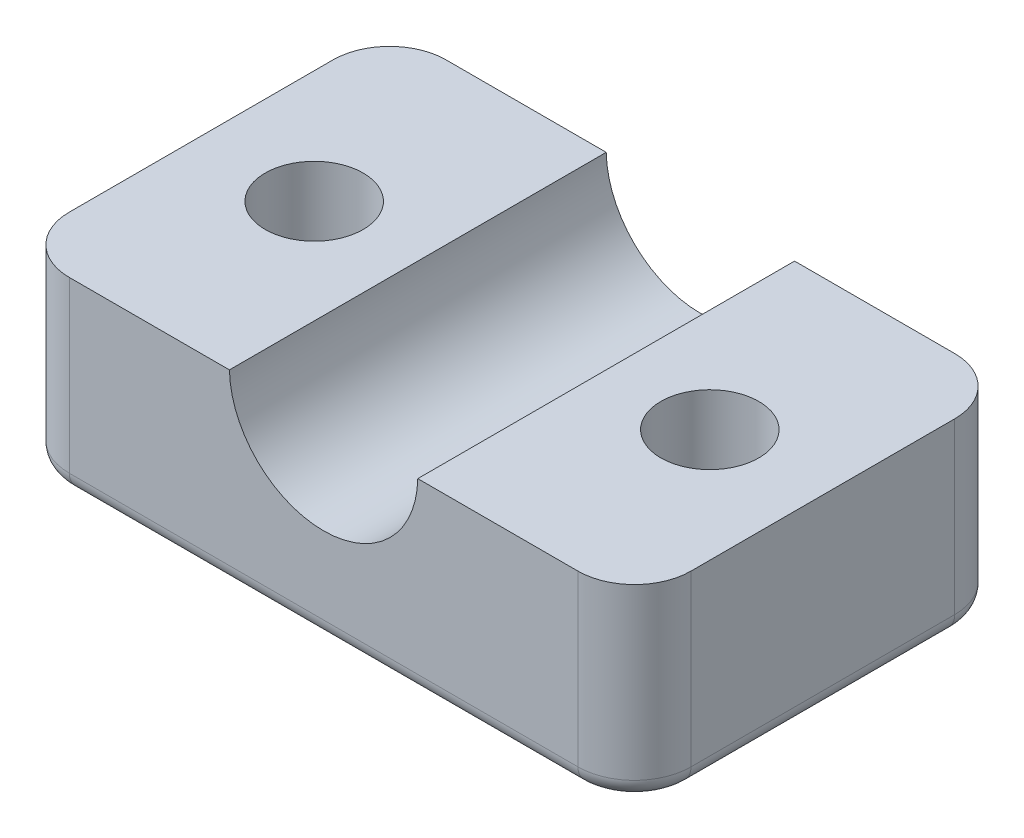
ISO-10303-21;
HEADER;
FILE_DESCRIPTION(('STEP AP214'),'2;1');
FILE_NAME('part.step','',(''),(''),'','','');
FILE_SCHEMA(('AUTOMOTIVE_DESIGN { 1 0 10303 214 1 1 1 1 }'));
ENDSEC;
DATA;
#1=APPLICATION_CONTEXT('core data for automotive mechanical design processes');
#2=APPLICATION_PROTOCOL_DEFINITION('international standard','automotive_design',2000,#1);
#3=PRODUCT_CONTEXT('',#1,'mechanical');
#4=PRODUCT('Part','Part','',(#3));
#5=PRODUCT_RELATED_PRODUCT_CATEGORY('part','',(#4));
#6=PRODUCT_DEFINITION_FORMATION('','',#4);
#7=PRODUCT_DEFINITION_CONTEXT('part definition',#1,'design');
#8=PRODUCT_DEFINITION('design','',#6,#7);
#9=PRODUCT_DEFINITION_SHAPE('','',#8);
#10=(LENGTH_UNIT() NAMED_UNIT(*) SI_UNIT(.MILLI.,.METRE.));
#11=(NAMED_UNIT(*) PLANE_ANGLE_UNIT() SI_UNIT($,.RADIAN.));
#12=(NAMED_UNIT(*) SI_UNIT($,.STERADIAN.) SOLID_ANGLE_UNIT());
#13=UNCERTAINTY_MEASURE_WITH_UNIT(LENGTH_MEASURE(1.E-05),#10,'distance_accuracy_value','');
#14=(GEOMETRIC_REPRESENTATION_CONTEXT(3) GLOBAL_UNCERTAINTY_ASSIGNED_CONTEXT((#13)) GLOBAL_UNIT_ASSIGNED_CONTEXT((#10,
#11,#12)) REPRESENTATION_CONTEXT('',''));
#15=CARTESIAN_POINT('',(0.,0.,0.));
#16=DIRECTION('',(0.,0.,1.));
#17=DIRECTION('',(1.,0.,0.));
#18=AXIS2_PLACEMENT_3D('',#15,#16,#17);
#19=CARTESIAN_POINT('',(-13.5,10.,7.));
#20=DIRECTION('',(0.,1.,0.));
#21=DIRECTION('',(0.,0.,1.));
#22=AXIS2_PLACEMENT_3D('',#19,#20,#21);
#23=PLANE('',#22);
#24=DIRECTION('',(0.,0.,-1.));
#25=VECTOR('',#24,1.);
#26=CARTESIAN_POINT('',(4.99899989998,10.,24.142135623731));
#27=LINE('',#26,#25);
#28=CARTESIAN_POINT('',(4.99899989998,10.,10.));
#29=VERTEX_POINT('',#28);
#30=CARTESIAN_POINT('',(4.99899989998,10.,-10.));
#31=VERTEX_POINT('',#30);
#32=EDGE_CURVE('E145',#29,#31,#27,.T.);
#33=ORIENTED_EDGE('',*,*,#32,.F.);
#34=DIRECTION('',(1.,0.,0.));
#35=VECTOR('',#34,1.);
#36=CARTESIAN_POINT('',(-13.5,10.,10.));
#37=LINE('',#36,#35);
#38=CARTESIAN_POINT('',(13.5,10.,10.));
#39=VERTEX_POINT('',#38);
#40=EDGE_CURVE('E151',#29,#39,#37,.T.);
#41=ORIENTED_EDGE('',*,*,#40,.T.);
#42=CARTESIAN_POINT('',(13.5,10.,7.));
#43=DIRECTION('',(0.,1.,0.));
#44=DIRECTION('',(0.,0.,1.));
#45=AXIS2_PLACEMENT_3D('',#42,#43,#44);
#46=CIRCLE('',#45,3.);
#47=CARTESIAN_POINT('',(16.5,10.,7.));
#48=VERTEX_POINT('',#47);
#49=EDGE_CURVE('E158',#39,#48,#46,.T.);
#50=ORIENTED_EDGE('',*,*,#49,.T.);
#51=DIRECTION('',(0.,0.,-1.));
#52=VECTOR('',#51,1.);
#53=CARTESIAN_POINT('',(16.5,10.,7.));
#54=LINE('',#53,#52);
#55=CARTESIAN_POINT('',(16.5,10.,-7.));
#56=VERTEX_POINT('',#55);
#57=EDGE_CURVE('E160',#48,#56,#54,.T.);
#58=ORIENTED_EDGE('',*,*,#57,.T.);
#59=CARTESIAN_POINT('',(13.5,10.,-7.));
#60=DIRECTION('',(0.,1.,0.));
#61=DIRECTION('',(0.,0.,1.));
#62=AXIS2_PLACEMENT_3D('',#59,#60,#61);
#63=CIRCLE('',#62,3.);
#64=CARTESIAN_POINT('',(13.5,10.,-10.));
#65=VERTEX_POINT('',#64);
#66=EDGE_CURVE('E166',#56,#65,#63,.T.);
#67=ORIENTED_EDGE('',*,*,#66,.T.);
#68=DIRECTION('',(-1.,0.,0.));
#69=VECTOR('',#68,1.);
#70=CARTESIAN_POINT('',(-13.5,10.,-10.));
#71=LINE('',#70,#69);
#72=EDGE_CURVE('E169',#65,#31,#71,.T.);
#73=ORIENTED_EDGE('',*,*,#72,.T.);
#74=EDGE_LOOP('',(#33,#41,#50,#58,#67,#73));
#75=FACE_BOUND('',#74,.T.);
#76=CARTESIAN_POINT('',(10.5,10.,0.));
#77=DIRECTION('',(0.,1.,0.));
#78=DIRECTION('',(0.,0.,1.));
#79=AXIS2_PLACEMENT_3D('',#76,#77,#78);
#80=CIRCLE('',#79,2.6);
#81=CARTESIAN_POINT('',(10.5,10.,2.6));
#82=VERTEX_POINT('',#81);
#83=EDGE_CURVE('E264',#82,#82,#80,.T.);
#84=ORIENTED_EDGE('',*,*,#83,.F.);
#85=EDGE_LOOP('',(#84));
#86=FACE_BOUND('',#85,.T.);
#87=ADVANCED_FACE('F33',(#75,#86),#23,.T.);
#88=DIRECTION('',(0.,0.,-1.));
#89=VECTOR('',#88,1.);
#90=CARTESIAN_POINT('',(-4.99899989998,10.,24.142135623731));
#91=LINE('',#90,#89);
#92=CARTESIAN_POINT('',(-4.99899989998,10.,-10.));
#93=VERTEX_POINT('',#92);
#94=CARTESIAN_POINT('',(-4.99899989998,10.,10.));
#95=VERTEX_POINT('',#94);
#96=EDGE_CURVE('E135',#93,#95,#91,.F.);
#97=ORIENTED_EDGE('',*,*,#96,.F.);
#98=CARTESIAN_POINT('',(-13.5,10.,-10.));
#99=VERTEX_POINT('',#98);
#100=EDGE_CURVE('E168',#93,#99,#71,.T.);
#101=ORIENTED_EDGE('',*,*,#100,.T.);
#102=CARTESIAN_POINT('',(-13.5,10.,-7.));
#103=DIRECTION('',(0.,1.,0.));
#104=DIRECTION('',(0.,0.,1.));
#105=AXIS2_PLACEMENT_3D('',#102,#103,#104);
#106=CIRCLE('',#105,3.);
#107=CARTESIAN_POINT('',(-16.5,10.,-7.));
#108=VERTEX_POINT('',#107);
#109=EDGE_CURVE('E172',#99,#108,#106,.T.);
#110=ORIENTED_EDGE('',*,*,#109,.T.);
#111=DIRECTION('',(0.,0.,1.));
#112=VECTOR('',#111,1.);
#113=CARTESIAN_POINT('',(-16.5,10.,7.));
#114=LINE('',#113,#112);
#115=CARTESIAN_POINT('',(-16.5,10.,7.));
#116=VERTEX_POINT('',#115);
#117=EDGE_CURVE('E174',#108,#116,#114,.T.);
#118=ORIENTED_EDGE('',*,*,#117,.T.);
#119=CARTESIAN_POINT('',(-13.5,10.,7.));
#120=DIRECTION('',(0.,1.,0.));
#121=DIRECTION('',(0.,0.,1.));
#122=AXIS2_PLACEMENT_3D('',#119,#120,#121);
#123=CIRCLE('',#122,3.);
#124=CARTESIAN_POINT('',(-13.5,10.,10.));
#125=VERTEX_POINT('',#124);
#126=EDGE_CURVE('E156',#116,#125,#123,.T.);
#127=ORIENTED_EDGE('',*,*,#126,.T.);
#128=EDGE_CURVE('E149',#125,#95,#37,.T.);
#129=ORIENTED_EDGE('',*,*,#128,.T.);
#130=EDGE_LOOP('',(#97,#101,#110,#118,#127,#129));
#131=FACE_BOUND('',#130,.T.);
#132=CARTESIAN_POINT('',(-10.5,10.,0.));
#133=DIRECTION('',(0.,1.,0.));
#134=DIRECTION('',(0.,0.,-1.));
#135=AXIS2_PLACEMENT_3D('',#132,#133,#134);
#136=CIRCLE('',#135,2.6);
#137=CARTESIAN_POINT('',(-10.5,10.,-2.6));
#138=VERTEX_POINT('',#137);
#139=EDGE_CURVE('E258',#138,#138,#136,.T.);
#140=ORIENTED_EDGE('',*,*,#139,.F.);
#141=EDGE_LOOP('',(#140));
#142=FACE_BOUND('',#141,.T.);
#143=ADVANCED_FACE('F153',(#131,#142),#23,.T.);
#144=CARTESIAN_POINT('',(-13.5,0.,7.));
#145=DIRECTION('',(0.,1.,0.));
#146=DIRECTION('',(0.,0.,1.));
#147=AXIS2_PLACEMENT_3D('',#144,#145,#146);
#148=PLANE('',#147);
#149=DIRECTION('',(1.,0.,0.));
#150=VECTOR('',#149,1.);
#151=CARTESIAN_POINT('',(-13.5,0.,9.));
#152=LINE('',#151,#150);
#153=CARTESIAN_POINT('',(13.5,0.,9.));
#154=VERTEX_POINT('',#153);
#155=CARTESIAN_POINT('',(-13.5,0.,9.));
#156=VERTEX_POINT('',#155);
#157=EDGE_CURVE('E200',#154,#156,#152,.F.);
#158=ORIENTED_EDGE('',*,*,#157,.T.);
#159=CARTESIAN_POINT('',(-13.5,0.,7.));
#160=DIRECTION('',(0.,1.,0.));
#161=DIRECTION('',(0.,0.,1.));
#162=AXIS2_PLACEMENT_3D('',#159,#160,#161);
#163=CIRCLE('',#162,2.);
#164=CARTESIAN_POINT('',(-15.5,0.,7.));
#165=VERTEX_POINT('',#164);
#166=EDGE_CURVE('E214',#156,#165,#163,.F.);
#167=ORIENTED_EDGE('',*,*,#166,.T.);
#168=DIRECTION('',(0.,0.,1.));
#169=VECTOR('',#168,1.);
#170=CARTESIAN_POINT('',(-15.5,0.,7.));
#171=LINE('',#170,#169);
#172=CARTESIAN_POINT('',(-15.5,0.,-7.));
#173=VERTEX_POINT('',#172);
#174=EDGE_CURVE('E212',#165,#173,#171,.F.);
#175=ORIENTED_EDGE('',*,*,#174,.T.);
#176=CARTESIAN_POINT('',(-13.5,0.,-7.));
#177=DIRECTION('',(0.,1.,0.));
#178=DIRECTION('',(0.,0.,1.));
#179=AXIS2_PLACEMENT_3D('',#176,#177,#178);
#180=CIRCLE('',#179,2.);
#181=CARTESIAN_POINT('',(-13.5,0.,-9.));
#182=VERTEX_POINT('',#181);
#183=EDGE_CURVE('E210',#173,#182,#180,.F.);
#184=ORIENTED_EDGE('',*,*,#183,.T.);
#185=DIRECTION('',(-1.,0.,0.));
#186=VECTOR('',#185,1.);
#187=CARTESIAN_POINT('',(-13.5,0.,-9.));
#188=LINE('',#187,#186);
#189=CARTESIAN_POINT('',(13.5,0.,-9.));
#190=VERTEX_POINT('',#189);
#191=EDGE_CURVE('E208',#182,#190,#188,.F.);
#192=ORIENTED_EDGE('',*,*,#191,.T.);
#193=CARTESIAN_POINT('',(13.5,0.,-7.));
#194=DIRECTION('',(0.,1.,0.));
#195=DIRECTION('',(0.,0.,1.));
#196=AXIS2_PLACEMENT_3D('',#193,#194,#195);
#197=CIRCLE('',#196,2.);
#198=CARTESIAN_POINT('',(15.5,0.,-7.));
#199=VERTEX_POINT('',#198);
#200=EDGE_CURVE('E206',#190,#199,#197,.F.);
#201=ORIENTED_EDGE('',*,*,#200,.T.);
#202=DIRECTION('',(0.,0.,-1.));
#203=VECTOR('',#202,1.);
#204=CARTESIAN_POINT('',(15.5,0.,7.));
#205=LINE('',#204,#203);
#206=CARTESIAN_POINT('',(15.5,0.,7.));
#207=VERTEX_POINT('',#206);
#208=EDGE_CURVE('E204',#199,#207,#205,.F.);
#209=ORIENTED_EDGE('',*,*,#208,.T.);
#210=CARTESIAN_POINT('',(13.5,0.,7.));
#211=DIRECTION('',(0.,1.,0.));
#212=DIRECTION('',(0.,0.,1.));
#213=AXIS2_PLACEMENT_3D('',#210,#211,#212);
#214=CIRCLE('',#213,2.);
#215=EDGE_CURVE('E202',#207,#154,#214,.F.);
#216=ORIENTED_EDGE('',*,*,#215,.T.);
#217=EDGE_LOOP('',(#158,#167,#175,#184,#192,#201,#209,#216));
#218=FACE_BOUND('',#217,.T.);
#219=CARTESIAN_POINT('',(10.5,0.,0.));
#220=DIRECTION('',(0.,1.,0.));
#221=DIRECTION('',(0.,0.,1.));
#222=AXIS2_PLACEMENT_3D('',#219,#220,#221);
#223=CIRCLE('',#222,2.6);
#224=CARTESIAN_POINT('',(10.5,0.,2.6));
#225=VERTEX_POINT('',#224);
#226=EDGE_CURVE('E261',#225,#225,#223,.T.);
#227=ORIENTED_EDGE('',*,*,#226,.T.);
#228=EDGE_LOOP('',(#227));
#229=FACE_BOUND('',#228,.T.);
#230=CARTESIAN_POINT('',(-10.5,0.,0.));
#231=DIRECTION('',(0.,1.,0.));
#232=DIRECTION('',(0.,0.,-1.));
#233=AXIS2_PLACEMENT_3D('',#230,#231,#232);
#234=CIRCLE('',#233,2.6);
#235=CARTESIAN_POINT('',(-10.5,0.,-2.6));
#236=VERTEX_POINT('',#235);
#237=EDGE_CURVE('E257',#236,#236,#234,.T.);
#238=ORIENTED_EDGE('',*,*,#237,.T.);
#239=EDGE_LOOP('',(#238));
#240=FACE_BOUND('',#239,.T.);
#241=ADVANCED_FACE('F269',(#218,#229,#240),#148,.F.);
#242=CARTESIAN_POINT('',(-13.5,10.,7.));
#243=DIRECTION('',(0.,-1.,0.));
#244=DIRECTION('',(0.,0.,-1.));
#245=AXIS2_PLACEMENT_3D('',#242,#243,#244);
#246=CYLINDRICAL_SURFACE('',#245,3.);
#247=DIRECTION('',(0.,-1.,0.));
#248=VECTOR('',#247,1.);
#249=CARTESIAN_POINT('',(-16.5,10.,7.));
#250=LINE('',#249,#248);
#251=CARTESIAN_POINT('',(-16.5,0.999999999999999,7.));
#252=VERTEX_POINT('',#251);
#253=EDGE_CURVE('E176',#116,#252,#250,.T.);
#254=ORIENTED_EDGE('',*,*,#253,.T.);
#255=CARTESIAN_POINT('',(-13.5,0.999999999999999,7.));
#256=DIRECTION('',(0.,1.,0.));
#257=DIRECTION('',(0.,0.,1.));
#258=AXIS2_PLACEMENT_3D('',#255,#256,#257);
#259=CIRCLE('',#258,3.);
#260=CARTESIAN_POINT('',(-13.5,0.999999999999999,10.));
#261=VERTEX_POINT('',#260);
#262=EDGE_CURVE('E197',#252,#261,#259,.T.);
#263=ORIENTED_EDGE('',*,*,#262,.T.);
#264=DIRECTION('',(0.,-1.,0.));
#265=VECTOR('',#264,1.);
#266=CARTESIAN_POINT('',(-13.5,10.,10.));
#267=LINE('',#266,#265);
#268=EDGE_CURVE('E195',#125,#261,#267,.T.);
#269=ORIENTED_EDGE('',*,*,#268,.F.);
#270=ORIENTED_EDGE('',*,*,#126,.F.);
#271=EDGE_LOOP('',(#254,#263,#269,#270));
#272=FACE_BOUND('',#271,.T.);
#273=ADVANCED_FACE('F296',(#272),#246,.T.);
#274=CARTESIAN_POINT('',(-13.5,10.,10.));
#275=DIRECTION('',(0.,0.,-1.));
#276=DIRECTION('',(-1.,0.,0.));
#277=AXIS2_PLACEMENT_3D('',#274,#275,#276);
#278=PLANE('',#277);
#279=ORIENTED_EDGE('',*,*,#268,.T.);
#280=DIRECTION('',(1.,0.,0.));
#281=VECTOR('',#280,1.);
#282=CARTESIAN_POINT('',(-13.5,0.999999999999999,10.));
#283=LINE('',#282,#281);
#284=CARTESIAN_POINT('',(13.5,0.999999999999999,10.));
#285=VERTEX_POINT('',#284);
#286=EDGE_CURVE('E11',#261,#285,#283,.T.);
#287=ORIENTED_EDGE('',*,*,#286,.T.);
#288=DIRECTION('',(0.,-1.,0.));
#289=VECTOR('',#288,1.);
#290=CARTESIAN_POINT('',(13.5,10.,10.));
#291=LINE('',#290,#289);
#292=EDGE_CURVE('E193',#39,#285,#291,.T.);
#293=ORIENTED_EDGE('',*,*,#292,.F.);
#294=ORIENTED_EDGE('',*,*,#40,.F.);
#295=CARTESIAN_POINT('',(0.,10.1,10.));
#296=DIRECTION('',(0.,0.,-1.));
#297=DIRECTION('',(-1.,0.,0.));
#298=AXIS2_PLACEMENT_3D('',#295,#296,#297);
#299=CIRCLE('',#298,5.);
#300=EDGE_CURVE('E138',#95,#29,#299,.F.);
#301=ORIENTED_EDGE('',*,*,#300,.F.);
#302=ORIENTED_EDGE('',*,*,#128,.F.);
#303=EDGE_LOOP('',(#279,#287,#293,#294,#301,#302));
#304=FACE_BOUND('',#303,.T.);
#305=ADVANCED_FACE('F148',(#304),#278,.F.);
#306=CARTESIAN_POINT('',(13.5,10.,7.));
#307=DIRECTION('',(0.,-1.,0.));
#308=DIRECTION('',(0.,0.,-1.));
#309=AXIS2_PLACEMENT_3D('',#306,#307,#308);
#310=CYLINDRICAL_SURFACE('',#309,3.);
#311=ORIENTED_EDGE('',*,*,#292,.T.);
#312=CARTESIAN_POINT('',(13.5,0.999999999999999,7.));
#313=DIRECTION('',(0.,1.,0.));
#314=DIRECTION('',(0.,0.,1.));
#315=AXIS2_PLACEMENT_3D('',#312,#313,#314);
#316=CIRCLE('',#315,3.);
#317=CARTESIAN_POINT('',(16.5,0.999999999999999,7.));
#318=VERTEX_POINT('',#317);
#319=EDGE_CURVE('E42',#285,#318,#316,.T.);
#320=ORIENTED_EDGE('',*,*,#319,.T.);
#321=DIRECTION('',(0.,-1.,0.));
#322=VECTOR('',#321,1.);
#323=CARTESIAN_POINT('',(16.5,10.,7.));
#324=LINE('',#323,#322);
#325=EDGE_CURVE('E191',#48,#318,#324,.T.);
#326=ORIENTED_EDGE('',*,*,#325,.F.);
#327=ORIENTED_EDGE('',*,*,#49,.F.);
#328=EDGE_LOOP('',(#311,#320,#326,#327));
#329=FACE_BOUND('',#328,.T.);
#330=ADVANCED_FACE('F313',(#329),#310,.T.);
#331=CARTESIAN_POINT('',(16.5,10.,7.));
#332=DIRECTION('',(-1.,0.,0.));
#333=DIRECTION('',(0.,0.,1.));
#334=AXIS2_PLACEMENT_3D('',#331,#332,#333);
#335=PLANE('',#334);
#336=ORIENTED_EDGE('',*,*,#325,.T.);
#337=DIRECTION('',(0.,0.,-1.));
#338=VECTOR('',#337,1.);
#339=CARTESIAN_POINT('',(16.5,0.999999999999999,7.));
#340=LINE('',#339,#338);
#341=CARTESIAN_POINT('',(16.5,0.999999999999999,-7.));
#342=VERTEX_POINT('',#341);
#343=EDGE_CURVE('E225',#318,#342,#340,.T.);
#344=ORIENTED_EDGE('',*,*,#343,.T.);
#345=DIRECTION('',(0.,-1.,0.));
#346=VECTOR('',#345,1.);
#347=CARTESIAN_POINT('',(16.5,10.,-7.));
#348=LINE('',#347,#346);
#349=EDGE_CURVE('E188',#56,#342,#348,.T.);
#350=ORIENTED_EDGE('',*,*,#349,.F.);
#351=ORIENTED_EDGE('',*,*,#57,.F.);
#352=EDGE_LOOP('',(#336,#344,#350,#351));
#353=FACE_BOUND('',#352,.T.);
#354=ADVANCED_FACE('F309',(#353),#335,.F.);
#355=CARTESIAN_POINT('',(13.5,10.,-7.));
#356=DIRECTION('',(0.,-1.,0.));
#357=DIRECTION('',(0.,0.,-1.));
#358=AXIS2_PLACEMENT_3D('',#355,#356,#357);
#359=CYLINDRICAL_SURFACE('',#358,3.);
#360=ORIENTED_EDGE('',*,*,#349,.T.);
#361=CARTESIAN_POINT('',(13.5,0.999999999999999,-7.));
#362=DIRECTION('',(0.,1.,0.));
#363=DIRECTION('',(0.,0.,1.));
#364=AXIS2_PLACEMENT_3D('',#361,#362,#363);
#365=CIRCLE('',#364,3.);
#366=CARTESIAN_POINT('',(13.5,0.999999999999999,-10.));
#367=VERTEX_POINT('',#366);
#368=EDGE_CURVE('E223',#342,#367,#365,.T.);
#369=ORIENTED_EDGE('',*,*,#368,.T.);
#370=DIRECTION('',(0.,-1.,0.));
#371=VECTOR('',#370,1.);
#372=CARTESIAN_POINT('',(13.5,10.,-10.));
#373=LINE('',#372,#371);
#374=EDGE_CURVE('E185',#65,#367,#373,.T.);
#375=ORIENTED_EDGE('',*,*,#374,.F.);
#376=ORIENTED_EDGE('',*,*,#66,.F.);
#377=EDGE_LOOP('',(#360,#369,#375,#376));
#378=FACE_BOUND('',#377,.T.);
#379=ADVANCED_FACE('F305',(#378),#359,.T.);
#380=CARTESIAN_POINT('',(-13.5,10.,-10.));
#381=DIRECTION('',(0.,0.,1.));
#382=DIRECTION('',(1.,0.,0.));
#383=AXIS2_PLACEMENT_3D('',#380,#381,#382);
#384=PLANE('',#383);
#385=ORIENTED_EDGE('',*,*,#374,.T.);
#386=DIRECTION('',(-1.,0.,0.));
#387=VECTOR('',#386,1.);
#388=CARTESIAN_POINT('',(-13.5,0.999999999999999,-10.));
#389=LINE('',#388,#387);
#390=CARTESIAN_POINT('',(-13.5,0.999999999999999,-10.));
#391=VERTEX_POINT('',#390);
#392=EDGE_CURVE('E221',#367,#391,#389,.T.);
#393=ORIENTED_EDGE('',*,*,#392,.T.);
#394=DIRECTION('',(0.,-1.,0.));
#395=VECTOR('',#394,1.);
#396=CARTESIAN_POINT('',(-13.5,10.,-10.));
#397=LINE('',#396,#395);
#398=EDGE_CURVE('E182',#99,#391,#397,.T.);
#399=ORIENTED_EDGE('',*,*,#398,.F.);
#400=ORIENTED_EDGE('',*,*,#100,.F.);
#401=CARTESIAN_POINT('',(0.,10.1,-10.));
#402=DIRECTION('',(0.,0.,-1.));
#403=DIRECTION('',(-1.,0.,0.));
#404=AXIS2_PLACEMENT_3D('',#401,#402,#403);
#405=CIRCLE('',#404,5.);
#406=EDGE_CURVE('E141',#31,#93,#405,.T.);
#407=ORIENTED_EDGE('',*,*,#406,.F.);
#408=ORIENTED_EDGE('',*,*,#72,.F.);
#409=EDGE_LOOP('',(#385,#393,#399,#400,#407,#408));
#410=FACE_BOUND('',#409,.T.);
#411=ADVANCED_FACE('F301',(#410),#384,.F.);
#412=CARTESIAN_POINT('',(-13.5,10.,-7.));
#413=DIRECTION('',(0.,-1.,0.));
#414=DIRECTION('',(0.,0.,-1.));
#415=AXIS2_PLACEMENT_3D('',#412,#413,#414);
#416=CYLINDRICAL_SURFACE('',#415,3.);
#417=ORIENTED_EDGE('',*,*,#398,.T.);
#418=CARTESIAN_POINT('',(-13.5,0.999999999999999,-7.));
#419=DIRECTION('',(0.,1.,0.));
#420=DIRECTION('',(0.,0.,1.));
#421=AXIS2_PLACEMENT_3D('',#418,#419,#420);
#422=CIRCLE('',#421,3.);
#423=CARTESIAN_POINT('',(-16.5,0.999999999999999,-7.));
#424=VERTEX_POINT('',#423);
#425=EDGE_CURVE('E219',#391,#424,#422,.T.);
#426=ORIENTED_EDGE('',*,*,#425,.T.);
#427=DIRECTION('',(0.,-1.,0.));
#428=VECTOR('',#427,1.);
#429=CARTESIAN_POINT('',(-16.5,10.,-7.));
#430=LINE('',#429,#428);
#431=EDGE_CURVE('E179',#108,#424,#430,.T.);
#432=ORIENTED_EDGE('',*,*,#431,.F.);
#433=ORIENTED_EDGE('',*,*,#109,.F.);
#434=EDGE_LOOP('',(#417,#426,#432,#433));
#435=FACE_BOUND('',#434,.T.);
#436=ADVANCED_FACE('F284',(#435),#416,.T.);
#437=CARTESIAN_POINT('',(-16.5,10.,7.));
#438=DIRECTION('',(1.,0.,0.));
#439=DIRECTION('',(0.,0.,-1.));
#440=AXIS2_PLACEMENT_3D('',#437,#438,#439);
#441=PLANE('',#440);
#442=ORIENTED_EDGE('',*,*,#431,.T.);
#443=DIRECTION('',(0.,0.,1.));
#444=VECTOR('',#443,1.);
#445=CARTESIAN_POINT('',(-16.5,0.999999999999999,7.));
#446=LINE('',#445,#444);
#447=EDGE_CURVE('E217',#424,#252,#446,.T.);
#448=ORIENTED_EDGE('',*,*,#447,.T.);
#449=ORIENTED_EDGE('',*,*,#253,.F.);
#450=ORIENTED_EDGE('',*,*,#117,.F.);
#451=EDGE_LOOP('',(#442,#448,#449,#450));
#452=FACE_BOUND('',#451,.T.);
#453=ADVANCED_FACE('F275',(#452),#441,.F.);
#454=CARTESIAN_POINT('',(10.5,10.,0.));
#455=DIRECTION('',(0.,-1.,0.));
#456=DIRECTION('',(0.,0.,-1.));
#457=AXIS2_PLACEMENT_3D('',#454,#455,#456);
#458=CYLINDRICAL_SURFACE('',#457,2.6);
#459=ORIENTED_EDGE('',*,*,#83,.T.);
#460=EDGE_LOOP('',(#459));
#461=FACE_BOUND('',#460,.T.);
#462=ORIENTED_EDGE('',*,*,#226,.F.);
#463=EDGE_LOOP('',(#462));
#464=FACE_BOUND('',#463,.T.);
#465=ADVANCED_FACE('F272',(#461,#464),#458,.F.);
#466=CARTESIAN_POINT('',(-10.5,10.,0.));
#467=DIRECTION('',(0.,-1.,0.));
#468=DIRECTION('',(0.,0.,-1.));
#469=AXIS2_PLACEMENT_3D('',#466,#467,#468);
#470=CYLINDRICAL_SURFACE('',#469,2.6);
#471=ORIENTED_EDGE('',*,*,#139,.T.);
#472=EDGE_LOOP('',(#471));
#473=FACE_BOUND('',#472,.T.);
#474=ORIENTED_EDGE('',*,*,#237,.F.);
#475=EDGE_LOOP('',(#474));
#476=FACE_BOUND('',#475,.T.);
#477=ADVANCED_FACE('F274',(#473,#476),#470,.F.);
#478=CARTESIAN_POINT('',(0.,10.1,24.142135623731));
#479=DIRECTION('',(0.,0.,-1.));
#480=DIRECTION('',(-1.,0.,0.));
#481=AXIS2_PLACEMENT_3D('',#478,#479,#480);
#482=CYLINDRICAL_SURFACE('',#481,5.);
#483=ORIENTED_EDGE('',*,*,#32,.T.);
#484=ORIENTED_EDGE('',*,*,#406,.T.);
#485=ORIENTED_EDGE('',*,*,#96,.T.);
#486=ORIENTED_EDGE('',*,*,#300,.T.);
#487=EDGE_LOOP('',(#483,#484,#485,#486));
#488=FACE_BOUND('',#487,.T.);
#489=ADVANCED_FACE('F137',(#488),#482,.F.);
#490=CARTESIAN_POINT('',(13.5,0.999999999999999,-7.));
#491=DIRECTION('',(0.,1.,0.));
#492=DIRECTION('',(0.,0.,1.));
#493=AXIS2_PLACEMENT_3D('',#490,#491,#492);
#494=TOROIDAL_SURFACE('',#493,2.,1.);
#495=CARTESIAN_POINT('',(15.5,1.,-7.));
#496=DIRECTION('',(0.,0.,1.));
#497=DIRECTION('',(1.,0.,0.));
#498=AXIS2_PLACEMENT_3D('',#495,#496,#497);
#499=CIRCLE('',#498,1.);
#500=EDGE_CURVE('E243',#199,#342,#499,.T.);
#501=ORIENTED_EDGE('',*,*,#500,.F.);
#502=ORIENTED_EDGE('',*,*,#200,.F.);
#503=CARTESIAN_POINT('',(13.5,0.999999999999999,-9.));
#504=DIRECTION('',(-1.,0.,0.));
#505=DIRECTION('',(0.,0.,1.));
#506=AXIS2_PLACEMENT_3D('',#503,#504,#505);
#507=CIRCLE('',#506,1.);
#508=EDGE_CURVE('E37',#367,#190,#507,.T.);
#509=ORIENTED_EDGE('',*,*,#508,.F.);
#510=ORIENTED_EDGE('',*,*,#368,.F.);
#511=EDGE_LOOP('',(#501,#502,#509,#510));
#512=FACE_BOUND('',#511,.T.);
#513=ADVANCED_FACE('F35',(#512),#494,.T.);
#514=CARTESIAN_POINT('',(-13.5,0.999999999999999,-9.));
#515=DIRECTION('',(-1.,0.,0.));
#516=DIRECTION('',(0.,0.,1.));
#517=AXIS2_PLACEMENT_3D('',#514,#515,#516);
#518=CYLINDRICAL_SURFACE('',#517,1.);
#519=ORIENTED_EDGE('',*,*,#508,.T.);
#520=ORIENTED_EDGE('',*,*,#191,.F.);
#521=CARTESIAN_POINT('',(-13.5,0.999999999999999,-9.));
#522=DIRECTION('',(-1.,0.,0.));
#523=DIRECTION('',(0.,0.,1.));
#524=AXIS2_PLACEMENT_3D('',#521,#522,#523);
#525=CIRCLE('',#524,1.);
#526=EDGE_CURVE('E241',#391,#182,#525,.T.);
#527=ORIENTED_EDGE('',*,*,#526,.F.);
#528=ORIENTED_EDGE('',*,*,#392,.F.);
#529=EDGE_LOOP('',(#519,#520,#527,#528));
#530=FACE_BOUND('',#529,.T.);
#531=ADVANCED_FACE('F344',(#530),#518,.T.);
#532=CARTESIAN_POINT('',(15.5,0.999999999999999,7.));
#533=DIRECTION('',(0.,0.,-1.));
#534=DIRECTION('',(-1.,0.,0.));
#535=AXIS2_PLACEMENT_3D('',#532,#533,#534);
#536=CYLINDRICAL_SURFACE('',#535,1.);
#537=ORIENTED_EDGE('',*,*,#500,.T.);
#538=ORIENTED_EDGE('',*,*,#343,.F.);
#539=CARTESIAN_POINT('',(15.5,1.,7.));
#540=DIRECTION('',(0.,0.,1.));
#541=DIRECTION('',(1.,0.,0.));
#542=AXIS2_PLACEMENT_3D('',#539,#540,#541);
#543=CIRCLE('',#542,1.);
#544=EDGE_CURVE('E238',#207,#318,#543,.T.);
#545=ORIENTED_EDGE('',*,*,#544,.F.);
#546=ORIENTED_EDGE('',*,*,#208,.F.);
#547=EDGE_LOOP('',(#537,#538,#545,#546));
#548=FACE_BOUND('',#547,.T.);
#549=ADVANCED_FACE('F341',(#548),#536,.T.);
#550=CARTESIAN_POINT('',(-13.5,0.999999999999999,-7.));
#551=DIRECTION('',(0.,1.,0.));
#552=DIRECTION('',(0.,0.,1.));
#553=AXIS2_PLACEMENT_3D('',#550,#551,#552);
#554=TOROIDAL_SURFACE('',#553,2.,1.);
#555=ORIENTED_EDGE('',*,*,#526,.T.);
#556=ORIENTED_EDGE('',*,*,#183,.F.);
#557=CARTESIAN_POINT('',(-15.5,0.999999999999999,-7.));
#558=DIRECTION('',(0.,0.,1.));
#559=DIRECTION('',(1.,0.,0.));
#560=AXIS2_PLACEMENT_3D('',#557,#558,#559);
#561=CIRCLE('',#560,1.);
#562=EDGE_CURVE('E235',#424,#173,#561,.T.);
#563=ORIENTED_EDGE('',*,*,#562,.F.);
#564=ORIENTED_EDGE('',*,*,#425,.F.);
#565=EDGE_LOOP('',(#555,#556,#563,#564));
#566=FACE_BOUND('',#565,.T.);
#567=ADVANCED_FACE('F337',(#566),#554,.T.);
#568=CARTESIAN_POINT('',(13.5,0.999999999999999,7.));
#569=DIRECTION('',(0.,1.,0.));
#570=DIRECTION('',(0.,0.,1.));
#571=AXIS2_PLACEMENT_3D('',#568,#569,#570);
#572=TOROIDAL_SURFACE('',#571,2.,1.);
#573=ORIENTED_EDGE('',*,*,#544,.T.);
#574=ORIENTED_EDGE('',*,*,#319,.F.);
#575=CARTESIAN_POINT('',(13.5,1.,9.));
#576=DIRECTION('',(-1.,0.,0.));
#577=DIRECTION('',(0.,0.,1.));
#578=AXIS2_PLACEMENT_3D('',#575,#576,#577);
#579=CIRCLE('',#578,1.);
#580=EDGE_CURVE('E232',#154,#285,#579,.T.);
#581=ORIENTED_EDGE('',*,*,#580,.F.);
#582=ORIENTED_EDGE('',*,*,#215,.F.);
#583=EDGE_LOOP('',(#573,#574,#581,#582));
#584=FACE_BOUND('',#583,.T.);
#585=ADVANCED_FACE('F333',(#584),#572,.T.);
#586=CARTESIAN_POINT('',(-15.5,0.999999999999999,7.));
#587=DIRECTION('',(0.,0.,1.));
#588=DIRECTION('',(1.,0.,0.));
#589=AXIS2_PLACEMENT_3D('',#586,#587,#588);
#590=CYLINDRICAL_SURFACE('',#589,1.);
#591=ORIENTED_EDGE('',*,*,#562,.T.);
#592=ORIENTED_EDGE('',*,*,#174,.F.);
#593=CARTESIAN_POINT('',(-15.5,0.999999999999999,7.));
#594=DIRECTION('',(0.,0.,1.));
#595=DIRECTION('',(1.,0.,0.));
#596=AXIS2_PLACEMENT_3D('',#593,#594,#595);
#597=CIRCLE('',#596,1.);
#598=EDGE_CURVE('E230',#252,#165,#597,.T.);
#599=ORIENTED_EDGE('',*,*,#598,.F.);
#600=ORIENTED_EDGE('',*,*,#447,.F.);
#601=EDGE_LOOP('',(#591,#592,#599,#600));
#602=FACE_BOUND('',#601,.T.);
#603=ADVANCED_FACE('F329',(#602),#590,.T.);
#604=CARTESIAN_POINT('',(-13.5,0.999999999999999,9.));
#605=DIRECTION('',(1.,0.,0.));
#606=DIRECTION('',(0.,0.,-1.));
#607=AXIS2_PLACEMENT_3D('',#604,#605,#606);
#608=CYLINDRICAL_SURFACE('',#607,1.);
#609=ORIENTED_EDGE('',*,*,#580,.T.);
#610=ORIENTED_EDGE('',*,*,#286,.F.);
#611=CARTESIAN_POINT('',(-13.5,1.,9.));
#612=DIRECTION('',(-1.,0.,0.));
#613=DIRECTION('',(0.,0.,1.));
#614=AXIS2_PLACEMENT_3D('',#611,#612,#613);
#615=CIRCLE('',#614,1.);
#616=EDGE_CURVE('E228',#156,#261,#615,.T.);
#617=ORIENTED_EDGE('',*,*,#616,.F.);
#618=ORIENTED_EDGE('',*,*,#157,.F.);
#619=EDGE_LOOP('',(#609,#610,#617,#618));
#620=FACE_BOUND('',#619,.T.);
#621=ADVANCED_FACE('F325',(#620),#608,.T.);
#622=CARTESIAN_POINT('',(-13.5,0.999999999999999,7.));
#623=DIRECTION('',(0.,1.,0.));
#624=DIRECTION('',(0.,0.,1.));
#625=AXIS2_PLACEMENT_3D('',#622,#623,#624);
#626=TOROIDAL_SURFACE('',#625,2.,1.);
#627=ORIENTED_EDGE('',*,*,#598,.T.);
#628=ORIENTED_EDGE('',*,*,#166,.F.);
#629=ORIENTED_EDGE('',*,*,#616,.T.);
#630=ORIENTED_EDGE('',*,*,#262,.F.);
#631=EDGE_LOOP('',(#627,#628,#629,#630));
#632=FACE_BOUND('',#631,.T.);
#633=ADVANCED_FACE('F322',(#632),#626,.T.);
#634=CLOSED_SHELL('',(#87,#143,#241,#273,#305,#330,#354,#379,#411,#436,#453,#465,#477,#489,#513,
#531,#549,#567,#585,#603,#621,#633));
#635=MANIFOLD_SOLID_BREP('B2',#634);
#636=ADVANCED_BREP_SHAPE_REPRESENTATION('',(#18,#635),#14);
#637=SHAPE_DEFINITION_REPRESENTATION(#9,#636);
ENDSEC;
END-ISO-10303-21;
